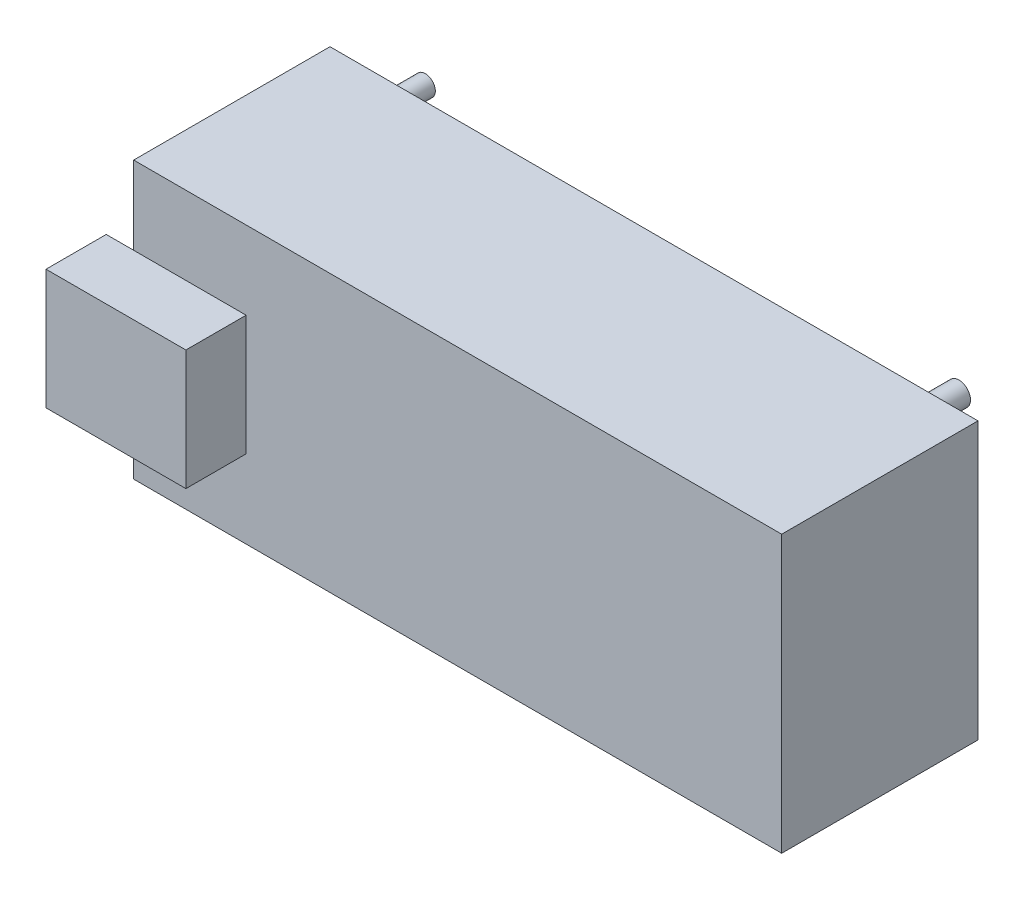
ISO-10303-21;
HEADER;
FILE_DESCRIPTION(('STEP AP214'),'2;1');
FILE_NAME('part.step','',(''),(''),'','','');
FILE_SCHEMA(('AUTOMOTIVE_DESIGN { 1 0 10303 214 1 1 1 1 }'));
ENDSEC;
DATA;
#1=APPLICATION_CONTEXT('core data for automotive mechanical design processes');
#2=APPLICATION_PROTOCOL_DEFINITION('international standard','automotive_design',2000,#1);
#3=PRODUCT_CONTEXT('',#1,'mechanical');
#4=PRODUCT('Part','Part','',(#3));
#5=PRODUCT_RELATED_PRODUCT_CATEGORY('part','',(#4));
#6=PRODUCT_DEFINITION_FORMATION('','',#4);
#7=PRODUCT_DEFINITION_CONTEXT('part definition',#1,'design');
#8=PRODUCT_DEFINITION('design','',#6,#7);
#9=PRODUCT_DEFINITION_SHAPE('','',#8);
#10=(LENGTH_UNIT() NAMED_UNIT(*) SI_UNIT(.MILLI.,.METRE.));
#11=(NAMED_UNIT(*) PLANE_ANGLE_UNIT() SI_UNIT($,.RADIAN.));
#12=(NAMED_UNIT(*) SI_UNIT($,.STERADIAN.) SOLID_ANGLE_UNIT());
#13=UNCERTAINTY_MEASURE_WITH_UNIT(LENGTH_MEASURE(1.E-05),#10,'distance_accuracy_value','');
#14=(GEOMETRIC_REPRESENTATION_CONTEXT(3) GLOBAL_UNCERTAINTY_ASSIGNED_CONTEXT((#13)) GLOBAL_UNIT_ASSIGNED_CONTEXT((#10,
#11,#12)) REPRESENTATION_CONTEXT('',''));
#15=CARTESIAN_POINT('',(0.,0.,0.));
#16=DIRECTION('',(0.,0.,1.));
#17=DIRECTION('',(1.,0.,0.));
#18=AXIS2_PLACEMENT_3D('',#15,#16,#17);
#19=CARTESIAN_POINT('',(-21.59,-9.2075,13.081));
#20=DIRECTION('',(0.,0.,-1.));
#21=DIRECTION('',(-1.,0.,0.));
#22=AXIS2_PLACEMENT_3D('',#19,#20,#21);
#23=PLANE('',#22);
#24=DIRECTION('',(1.,0.,0.));
#25=VECTOR('',#24,1.);
#26=CARTESIAN_POINT('',(-14.097,-4.0005,13.081));
#27=LINE('',#26,#25);
#28=CARTESIAN_POINT('',(-21.59,-4.0005,13.081));
#29=VERTEX_POINT('',#28);
#30=CARTESIAN_POINT('',(-14.097,-4.0005,13.081));
#31=VERTEX_POINT('',#30);
#32=EDGE_CURVE('E11',#29,#31,#27,.T.);
#33=ORIENTED_EDGE('',*,*,#32,.F.);
#34=DIRECTION('',(0.,-1.,0.));
#35=VECTOR('',#34,1.);
#36=CARTESIAN_POINT('',(-21.59,9.20749999999999,13.081));
#37=LINE('',#36,#35);
#38=CARTESIAN_POINT('',(-21.59,-9.2075,13.081));
#39=VERTEX_POINT('',#38);
#40=EDGE_CURVE('E155',#29,#39,#37,.T.);
#41=ORIENTED_EDGE('',*,*,#40,.T.);
#42=DIRECTION('',(1.,0.,0.));
#43=VECTOR('',#42,1.);
#44=CARTESIAN_POINT('',(21.59,-9.2075,13.081));
#45=LINE('',#44,#43);
#46=CARTESIAN_POINT('',(21.59,-9.2075,13.081));
#47=VERTEX_POINT('',#46);
#48=EDGE_CURVE('E153',#39,#47,#45,.T.);
#49=ORIENTED_EDGE('',*,*,#48,.T.);
#50=DIRECTION('',(0.,1.,0.));
#51=VECTOR('',#50,1.);
#52=CARTESIAN_POINT('',(21.59,9.2075,13.081));
#53=LINE('',#52,#51);
#54=CARTESIAN_POINT('',(21.59,9.2075,13.081));
#55=VERTEX_POINT('',#54);
#56=EDGE_CURVE('E157',#47,#55,#53,.T.);
#57=ORIENTED_EDGE('',*,*,#56,.T.);
#58=DIRECTION('',(-1.,0.,0.));
#59=VECTOR('',#58,1.);
#60=CARTESIAN_POINT('',(21.59,9.2075,13.081));
#61=LINE('',#60,#59);
#62=CARTESIAN_POINT('',(-21.59,9.20749999999999,13.081));
#63=VERTEX_POINT('',#62);
#64=EDGE_CURVE('E159',#55,#63,#61,.T.);
#65=ORIENTED_EDGE('',*,*,#64,.T.);
#66=CARTESIAN_POINT('',(-21.59,4.0005,13.081));
#67=VERTEX_POINT('',#66);
#68=EDGE_CURVE('E151',#63,#67,#37,.T.);
#69=ORIENTED_EDGE('',*,*,#68,.T.);
#70=DIRECTION('',(-1.,0.,0.));
#71=VECTOR('',#70,1.);
#72=CARTESIAN_POINT('',(-14.097,4.0005,13.081));
#73=LINE('',#72,#71);
#74=CARTESIAN_POINT('',(-14.097,4.0005,13.081));
#75=VERTEX_POINT('',#74);
#76=EDGE_CURVE('E51',#75,#67,#73,.T.);
#77=ORIENTED_EDGE('',*,*,#76,.F.);
#78=DIRECTION('',(0.,1.,0.));
#79=VECTOR('',#78,1.);
#80=CARTESIAN_POINT('',(-14.097,4.0005,13.081));
#81=LINE('',#80,#79);
#82=EDGE_CURVE('E47',#31,#75,#81,.T.);
#83=ORIENTED_EDGE('',*,*,#82,.F.);
#84=EDGE_LOOP('',(#33,#41,#49,#57,#65,#69,#77,#83));
#85=FACE_BOUND('',#84,.T.);
#86=ADVANCED_FACE('F30',(#85),#23,.F.);
#87=CARTESIAN_POINT('',(-21.59,-9.2075,0.));
#88=DIRECTION('',(0.,0.,-1.));
#89=DIRECTION('',(-1.,0.,0.));
#90=AXIS2_PLACEMENT_3D('',#87,#88,#89);
#91=PLANE('',#90);
#92=CARTESIAN_POINT('',(-17.78,-7.62,0.));
#93=DIRECTION('',(0.,0.,-1.));
#94=DIRECTION('',(-1.,0.,0.));
#95=AXIS2_PLACEMENT_3D('',#92,#93,#94);
#96=CIRCLE('',#95,0.762102327268927);
#97=CARTESIAN_POINT('',(-18.5421023272689,-7.62,0.));
#98=VERTEX_POINT('',#97);
#99=EDGE_CURVE('E131',#98,#98,#96,.T.);
#100=ORIENTED_EDGE('',*,*,#99,.F.);
#101=EDGE_LOOP('',(#100));
#102=FACE_BOUND('',#101,.T.);
#103=CARTESIAN_POINT('',(17.78,7.62,0.));
#104=DIRECTION('',(0.,0.,-1.));
#105=DIRECTION('',(-1.,0.,0.));
#106=AXIS2_PLACEMENT_3D('',#103,#104,#105);
#107=CIRCLE('',#106,0.769945782550909);
#108=CARTESIAN_POINT('',(17.0100542174491,7.62,0.));
#109=VERTEX_POINT('',#108);
#110=EDGE_CURVE('E142',#109,#109,#107,.T.);
#111=ORIENTED_EDGE('',*,*,#110,.F.);
#112=EDGE_LOOP('',(#111));
#113=FACE_BOUND('',#112,.T.);
#114=DIRECTION('',(0.,-1.,0.));
#115=VECTOR('',#114,1.);
#116=CARTESIAN_POINT('',(-21.59,9.20749999999999,0.));
#117=LINE('',#116,#115);
#118=CARTESIAN_POINT('',(-21.59,9.20749999999999,0.));
#119=VERTEX_POINT('',#118);
#120=CARTESIAN_POINT('',(-21.59,-9.2075,0.));
#121=VERTEX_POINT('',#120);
#122=EDGE_CURVE('E148',#119,#121,#117,.T.);
#123=ORIENTED_EDGE('',*,*,#122,.F.);
#124=DIRECTION('',(-1.,0.,0.));
#125=VECTOR('',#124,1.);
#126=CARTESIAN_POINT('',(21.59,9.2075,0.));
#127=LINE('',#126,#125);
#128=CARTESIAN_POINT('',(21.59,9.2075,0.));
#129=VERTEX_POINT('',#128);
#130=EDGE_CURVE('E168',#129,#119,#127,.T.);
#131=ORIENTED_EDGE('',*,*,#130,.F.);
#132=DIRECTION('',(0.,1.,0.));
#133=VECTOR('',#132,1.);
#134=CARTESIAN_POINT('',(21.59,9.2075,0.));
#135=LINE('',#134,#133);
#136=CARTESIAN_POINT('',(21.59,-9.2075,0.));
#137=VERTEX_POINT('',#136);
#138=EDGE_CURVE('E166',#137,#129,#135,.T.);
#139=ORIENTED_EDGE('',*,*,#138,.F.);
#140=DIRECTION('',(1.,0.,0.));
#141=VECTOR('',#140,1.);
#142=CARTESIAN_POINT('',(21.59,-9.2075,0.));
#143=LINE('',#142,#141);
#144=EDGE_CURVE('E164',#121,#137,#143,.T.);
#145=ORIENTED_EDGE('',*,*,#144,.F.);
#146=EDGE_LOOP('',(#123,#131,#139,#145));
#147=FACE_BOUND('',#146,.T.);
#148=CARTESIAN_POINT('',(17.78,-7.62,0.));
#149=DIRECTION('',(0.,0.,-1.));
#150=DIRECTION('',(-1.,0.,0.));
#151=AXIS2_PLACEMENT_3D('',#148,#149,#150);
#152=CIRCLE('',#151,0.721607374569189);
#153=CARTESIAN_POINT('',(17.0583926254308,-7.62,0.));
#154=VERTEX_POINT('',#153);
#155=EDGE_CURVE('E136',#154,#154,#152,.T.);
#156=ORIENTED_EDGE('',*,*,#155,.F.);
#157=EDGE_LOOP('',(#156));
#158=FACE_BOUND('',#157,.T.);
#159=CARTESIAN_POINT('',(-17.78,7.62,0.));
#160=DIRECTION('',(0.,0.,-1.));
#161=DIRECTION('',(-1.,0.,0.));
#162=AXIS2_PLACEMENT_3D('',#159,#160,#161);
#163=CIRCLE('',#162,0.671282843867284);
#164=CARTESIAN_POINT('',(-18.4512828438673,7.62,0.));
#165=VERTEX_POINT('',#164);
#166=EDGE_CURVE('E121',#165,#165,#163,.T.);
#167=ORIENTED_EDGE('',*,*,#166,.F.);
#168=EDGE_LOOP('',(#167));
#169=FACE_BOUND('',#168,.T.);
#170=ADVANCED_FACE('F192',(#102,#113,#147,#158,#169),#91,.T.);
#171=CARTESIAN_POINT('',(-21.59,9.20749999999999,13.081));
#172=DIRECTION('',(1.,0.,0.));
#173=DIRECTION('',(0.,0.,-1.));
#174=AXIS2_PLACEMENT_3D('',#171,#172,#173);
#175=PLANE('',#174);
#176=ORIENTED_EDGE('',*,*,#122,.T.);
#177=DIRECTION('',(0.,0.,-1.));
#178=VECTOR('',#177,1.);
#179=CARTESIAN_POINT('',(-21.59,-9.2075,13.081));
#180=LINE('',#179,#178);
#181=EDGE_CURVE('E34',#39,#121,#180,.T.);
#182=ORIENTED_EDGE('',*,*,#181,.F.);
#183=ORIENTED_EDGE('',*,*,#40,.F.);
#184=EDGE_CURVE('E154',#67,#29,#37,.T.);
#185=ORIENTED_EDGE('',*,*,#184,.F.);
#186=ORIENTED_EDGE('',*,*,#68,.F.);
#187=DIRECTION('',(0.,0.,-1.));
#188=VECTOR('',#187,1.);
#189=CARTESIAN_POINT('',(-21.59,9.20749999999999,13.081));
#190=LINE('',#189,#188);
#191=EDGE_CURVE('E161',#63,#119,#190,.T.);
#192=ORIENTED_EDGE('',*,*,#191,.T.);
#193=EDGE_LOOP('',(#176,#182,#183,#185,#186,#192));
#194=FACE_BOUND('',#193,.T.);
#195=ADVANCED_FACE('F32',(#194),#175,.F.);
#196=CARTESIAN_POINT('',(21.59,-9.2075,13.081));
#197=DIRECTION('',(0.,1.,0.));
#198=DIRECTION('',(-1.,0.,0.));
#199=AXIS2_PLACEMENT_3D('',#196,#197,#198);
#200=PLANE('',#199);
#201=ORIENTED_EDGE('',*,*,#144,.T.);
#202=DIRECTION('',(0.,0.,-1.));
#203=VECTOR('',#202,1.);
#204=CARTESIAN_POINT('',(21.59,-9.2075,13.081));
#205=LINE('',#204,#203);
#206=EDGE_CURVE('E174',#47,#137,#205,.T.);
#207=ORIENTED_EDGE('',*,*,#206,.F.);
#208=ORIENTED_EDGE('',*,*,#48,.F.);
#209=ORIENTED_EDGE('',*,*,#181,.T.);
#210=EDGE_LOOP('',(#201,#207,#208,#209));
#211=FACE_BOUND('',#210,.T.);
#212=ADVANCED_FACE('F184',(#211),#200,.F.);
#213=CARTESIAN_POINT('',(21.59,9.2075,13.081));
#214=DIRECTION('',(-1.,0.,0.));
#215=DIRECTION('',(0.,-1.,0.));
#216=AXIS2_PLACEMENT_3D('',#213,#214,#215);
#217=PLANE('',#216);
#218=ORIENTED_EDGE('',*,*,#138,.T.);
#219=DIRECTION('',(0.,0.,-1.));
#220=VECTOR('',#219,1.);
#221=CARTESIAN_POINT('',(21.59,9.2075,13.081));
#222=LINE('',#221,#220);
#223=EDGE_CURVE('E172',#55,#129,#222,.T.);
#224=ORIENTED_EDGE('',*,*,#223,.F.);
#225=ORIENTED_EDGE('',*,*,#56,.F.);
#226=ORIENTED_EDGE('',*,*,#206,.T.);
#227=EDGE_LOOP('',(#218,#224,#225,#226));
#228=FACE_BOUND('',#227,.T.);
#229=ADVANCED_FACE('F195',(#228),#217,.F.);
#230=CARTESIAN_POINT('',(21.59,9.2075,13.081));
#231=DIRECTION('',(0.,-1.,0.));
#232=DIRECTION('',(1.,0.,0.));
#233=AXIS2_PLACEMENT_3D('',#230,#231,#232);
#234=PLANE('',#233);
#235=ORIENTED_EDGE('',*,*,#130,.T.);
#236=ORIENTED_EDGE('',*,*,#191,.F.);
#237=ORIENTED_EDGE('',*,*,#64,.F.);
#238=ORIENTED_EDGE('',*,*,#223,.T.);
#239=EDGE_LOOP('',(#235,#236,#237,#238));
#240=FACE_BOUND('',#239,.T.);
#241=ADVANCED_FACE('F198',(#240),#234,.F.);
#242=CARTESIAN_POINT('',(17.78,7.62,-2.54));
#243=DIRECTION('',(0.,0.,1.));
#244=DIRECTION('',(1.,0.,0.));
#245=AXIS2_PLACEMENT_3D('',#242,#243,#244);
#246=CYLINDRICAL_SURFACE('',#245,0.769945782550909);
#247=CARTESIAN_POINT('',(17.78,7.62,-2.54));
#248=DIRECTION('',(0.,0.,-1.));
#249=DIRECTION('',(-1.,0.,0.));
#250=AXIS2_PLACEMENT_3D('',#247,#248,#249);
#251=CIRCLE('',#250,0.769945782550909);
#252=CARTESIAN_POINT('',(17.0100542174491,7.62,-2.54));
#253=VERTEX_POINT('',#252);
#254=EDGE_CURVE('E145',#253,#253,#251,.T.);
#255=ORIENTED_EDGE('',*,*,#254,.F.);
#256=EDGE_LOOP('',(#255));
#257=FACE_BOUND('',#256,.T.);
#258=ORIENTED_EDGE('',*,*,#110,.T.);
#259=EDGE_LOOP('',(#258));
#260=FACE_BOUND('',#259,.T.);
#261=ADVANCED_FACE('F238',(#257,#260),#246,.T.);
#262=CARTESIAN_POINT('',(17.78,7.62,-2.54));
#263=DIRECTION('',(0.,0.,-1.));
#264=DIRECTION('',(-1.,0.,0.));
#265=AXIS2_PLACEMENT_3D('',#262,#263,#264);
#266=PLANE('',#265);
#267=ORIENTED_EDGE('',*,*,#254,.T.);
#268=EDGE_LOOP('',(#267));
#269=FACE_BOUND('',#268,.T.);
#270=ADVANCED_FACE('F268',(#269),#266,.T.);
#271=CARTESIAN_POINT('',(17.78,-7.62,-2.54));
#272=DIRECTION('',(0.,0.,1.));
#273=DIRECTION('',(1.,0.,0.));
#274=AXIS2_PLACEMENT_3D('',#271,#272,#273);
#275=CYLINDRICAL_SURFACE('',#274,0.721607374569189);
#276=CARTESIAN_POINT('',(17.78,-7.62,-2.54));
#277=DIRECTION('',(0.,0.,-1.));
#278=DIRECTION('',(-1.,0.,0.));
#279=AXIS2_PLACEMENT_3D('',#276,#277,#278);
#280=CIRCLE('',#279,0.721607374569189);
#281=CARTESIAN_POINT('',(17.0583926254308,-7.62,-2.54));
#282=VERTEX_POINT('',#281);
#283=EDGE_CURVE('E139',#282,#282,#280,.T.);
#284=ORIENTED_EDGE('',*,*,#283,.F.);
#285=EDGE_LOOP('',(#284));
#286=FACE_BOUND('',#285,.T.);
#287=ORIENTED_EDGE('',*,*,#155,.T.);
#288=EDGE_LOOP('',(#287));
#289=FACE_BOUND('',#288,.T.);
#290=ADVANCED_FACE('F277',(#286,#289),#275,.T.);
#291=CARTESIAN_POINT('',(17.78,-7.62,-2.54));
#292=DIRECTION('',(0.,0.,-1.));
#293=DIRECTION('',(-1.,0.,0.));
#294=AXIS2_PLACEMENT_3D('',#291,#292,#293);
#295=PLANE('',#294);
#296=ORIENTED_EDGE('',*,*,#283,.T.);
#297=EDGE_LOOP('',(#296));
#298=FACE_BOUND('',#297,.T.);
#299=ADVANCED_FACE('F286',(#298),#295,.T.);
#300=CARTESIAN_POINT('',(-17.78,-7.62,-2.54));
#301=DIRECTION('',(0.,0.,1.));
#302=DIRECTION('',(1.,0.,0.));
#303=AXIS2_PLACEMENT_3D('',#300,#301,#302);
#304=CYLINDRICAL_SURFACE('',#303,0.762102327268927);
#305=CARTESIAN_POINT('',(-17.78,-7.62,-2.54));
#306=DIRECTION('',(0.,0.,-1.));
#307=DIRECTION('',(-1.,0.,0.));
#308=AXIS2_PLACEMENT_3D('',#305,#306,#307);
#309=CIRCLE('',#308,0.762102327268927);
#310=CARTESIAN_POINT('',(-18.5421023272689,-7.62,-2.54));
#311=VERTEX_POINT('',#310);
#312=EDGE_CURVE('E133',#311,#311,#309,.T.);
#313=ORIENTED_EDGE('',*,*,#312,.F.);
#314=EDGE_LOOP('',(#313));
#315=FACE_BOUND('',#314,.T.);
#316=ORIENTED_EDGE('',*,*,#99,.T.);
#317=EDGE_LOOP('',(#316));
#318=FACE_BOUND('',#317,.T.);
#319=ADVANCED_FACE('F296',(#315,#318),#304,.T.);
#320=CARTESIAN_POINT('',(-17.78,-7.62,-2.54));
#321=DIRECTION('',(0.,0.,-1.));
#322=DIRECTION('',(-1.,0.,0.));
#323=AXIS2_PLACEMENT_3D('',#320,#321,#322);
#324=PLANE('',#323);
#325=ORIENTED_EDGE('',*,*,#312,.T.);
#326=EDGE_LOOP('',(#325));
#327=FACE_BOUND('',#326,.T.);
#328=ADVANCED_FACE('F306',(#327),#324,.T.);
#329=CARTESIAN_POINT('',(-17.78,7.62,-2.54));
#330=DIRECTION('',(0.,0.,1.));
#331=DIRECTION('',(1.,0.,0.));
#332=AXIS2_PLACEMENT_3D('',#329,#330,#331);
#333=CYLINDRICAL_SURFACE('',#332,0.671282843867284);
#334=CARTESIAN_POINT('',(-17.78,7.62,-2.54));
#335=DIRECTION('',(0.,0.,-1.));
#336=DIRECTION('',(-1.,0.,0.));
#337=AXIS2_PLACEMENT_3D('',#334,#335,#336);
#338=CIRCLE('',#337,0.671282843867284);
#339=CARTESIAN_POINT('',(-18.4512828438673,7.62,-2.54));
#340=VERTEX_POINT('',#339);
#341=EDGE_CURVE('E124',#340,#340,#338,.T.);
#342=ORIENTED_EDGE('',*,*,#341,.F.);
#343=EDGE_LOOP('',(#342));
#344=FACE_BOUND('',#343,.T.);
#345=ORIENTED_EDGE('',*,*,#166,.T.);
#346=EDGE_LOOP('',(#345));
#347=FACE_BOUND('',#346,.T.);
#348=ADVANCED_FACE('F316',(#344,#347),#333,.T.);
#349=CARTESIAN_POINT('',(-17.78,7.62,-2.54));
#350=DIRECTION('',(0.,0.,-1.));
#351=DIRECTION('',(-1.,0.,0.));
#352=AXIS2_PLACEMENT_3D('',#349,#350,#351);
#353=PLANE('',#352);
#354=ORIENTED_EDGE('',*,*,#341,.T.);
#355=EDGE_LOOP('',(#354));
#356=FACE_BOUND('',#355,.T.);
#357=ADVANCED_FACE('F326',(#356),#353,.T.);
#358=CARTESIAN_POINT('',(-14.097,4.0005,17.0942));
#359=DIRECTION('',(-1.,0.,0.));
#360=DIRECTION('',(0.,0.,1.));
#361=AXIS2_PLACEMENT_3D('',#358,#359,#360);
#362=PLANE('',#361);
#363=ORIENTED_EDGE('',*,*,#82,.T.);
#364=DIRECTION('',(0.,0.,-1.));
#365=VECTOR('',#364,1.);
#366=CARTESIAN_POINT('',(-14.097,4.0005,17.0942));
#367=LINE('',#366,#365);
#368=CARTESIAN_POINT('',(-14.097,4.0005,17.0942));
#369=VERTEX_POINT('',#368);
#370=EDGE_CURVE('E104',#369,#75,#367,.T.);
#371=ORIENTED_EDGE('',*,*,#370,.F.);
#372=DIRECTION('',(0.,1.,0.));
#373=VECTOR('',#372,1.);
#374=CARTESIAN_POINT('',(-14.097,4.0005,17.0942));
#375=LINE('',#374,#373);
#376=CARTESIAN_POINT('',(-14.097,-4.0005,17.0942));
#377=VERTEX_POINT('',#376);
#378=EDGE_CURVE('E110',#377,#369,#375,.T.);
#379=ORIENTED_EDGE('',*,*,#378,.F.);
#380=DIRECTION('',(0.,0.,-1.));
#381=VECTOR('',#380,1.);
#382=CARTESIAN_POINT('',(-14.097,-4.0005,17.0942));
#383=LINE('',#382,#381);
#384=EDGE_CURVE('E216',#377,#31,#383,.T.);
#385=ORIENTED_EDGE('',*,*,#384,.T.);
#386=EDGE_LOOP('',(#363,#371,#379,#385));
#387=FACE_BOUND('',#386,.T.);
#388=ADVANCED_FACE('F120',(#387),#362,.F.);
#389=CARTESIAN_POINT('',(-14.097,4.0005,17.0942));
#390=DIRECTION('',(0.,-1.,0.));
#391=DIRECTION('',(0.,0.,-1.));
#392=AXIS2_PLACEMENT_3D('',#389,#390,#391);
#393=PLANE('',#392);
#394=ORIENTED_EDGE('',*,*,#76,.T.);
#395=CARTESIAN_POINT('',(-23.4188,4.0005,13.081));
#396=VERTEX_POINT('',#395);
#397=EDGE_CURVE('E207',#67,#396,#73,.T.);
#398=ORIENTED_EDGE('',*,*,#397,.T.);
#399=DIRECTION('',(0.,0.,-1.));
#400=VECTOR('',#399,1.);
#401=CARTESIAN_POINT('',(-23.4188,4.0005,17.0942));
#402=LINE('',#401,#400);
#403=CARTESIAN_POINT('',(-23.4188,4.0005,17.0942));
#404=VERTEX_POINT('',#403);
#405=EDGE_CURVE('E106',#404,#396,#402,.T.);
#406=ORIENTED_EDGE('',*,*,#405,.F.);
#407=DIRECTION('',(-1.,0.,0.));
#408=VECTOR('',#407,1.);
#409=CARTESIAN_POINT('',(-14.097,4.0005,17.0942));
#410=LINE('',#409,#408);
#411=EDGE_CURVE('E100',#369,#404,#410,.T.);
#412=ORIENTED_EDGE('',*,*,#411,.F.);
#413=ORIENTED_EDGE('',*,*,#370,.T.);
#414=EDGE_LOOP('',(#394,#398,#406,#412,#413));
#415=FACE_BOUND('',#414,.T.);
#416=ADVANCED_FACE('F102',(#415),#393,.F.);
#417=CARTESIAN_POINT('',(-23.4188,4.0005,17.0942));
#418=DIRECTION('',(1.,0.,0.));
#419=DIRECTION('',(0.,0.,-1.));
#420=AXIS2_PLACEMENT_3D('',#417,#418,#419);
#421=PLANE('',#420);
#422=DIRECTION('',(0.,-1.,0.));
#423=VECTOR('',#422,1.);
#424=CARTESIAN_POINT('',(-23.4188,4.0005,13.081));
#425=LINE('',#424,#423);
#426=CARTESIAN_POINT('',(-23.4188,-4.0005,13.081));
#427=VERTEX_POINT('',#426);
#428=EDGE_CURVE('E212',#396,#427,#425,.T.);
#429=ORIENTED_EDGE('',*,*,#428,.T.);
#430=DIRECTION('',(0.,0.,-1.));
#431=VECTOR('',#430,1.);
#432=CARTESIAN_POINT('',(-23.4188,-4.0005,17.0942));
#433=LINE('',#432,#431);
#434=CARTESIAN_POINT('',(-23.4188,-4.0005,17.0942));
#435=VERTEX_POINT('',#434);
#436=EDGE_CURVE('E126',#435,#427,#433,.T.);
#437=ORIENTED_EDGE('',*,*,#436,.F.);
#438=DIRECTION('',(0.,-1.,0.));
#439=VECTOR('',#438,1.);
#440=CARTESIAN_POINT('',(-23.4188,4.0005,17.0942));
#441=LINE('',#440,#439);
#442=EDGE_CURVE('E109',#404,#435,#441,.T.);
#443=ORIENTED_EDGE('',*,*,#442,.F.);
#444=ORIENTED_EDGE('',*,*,#405,.T.);
#445=EDGE_LOOP('',(#429,#437,#443,#444));
#446=FACE_BOUND('',#445,.T.);
#447=ADVANCED_FACE('F221',(#446),#421,.F.);
#448=CARTESIAN_POINT('',(-14.097,-4.0005,17.0942));
#449=DIRECTION('',(0.,1.,0.));
#450=DIRECTION('',(0.,0.,1.));
#451=AXIS2_PLACEMENT_3D('',#448,#449,#450);
#452=PLANE('',#451);
#453=EDGE_CURVE('E40',#427,#29,#27,.T.);
#454=ORIENTED_EDGE('',*,*,#453,.T.);
#455=ORIENTED_EDGE('',*,*,#32,.T.);
#456=ORIENTED_EDGE('',*,*,#384,.F.);
#457=DIRECTION('',(1.,0.,0.));
#458=VECTOR('',#457,1.);
#459=CARTESIAN_POINT('',(-14.097,-4.0005,17.0942));
#460=LINE('',#459,#458);
#461=EDGE_CURVE('E115',#435,#377,#460,.T.);
#462=ORIENTED_EDGE('',*,*,#461,.F.);
#463=ORIENTED_EDGE('',*,*,#436,.T.);
#464=EDGE_LOOP('',(#454,#455,#456,#462,#463));
#465=FACE_BOUND('',#464,.T.);
#466=ADVANCED_FACE('F210',(#465),#452,.F.);
#467=CARTESIAN_POINT('',(-14.097,-4.0005,17.0942));
#468=DIRECTION('',(0.,0.,-1.));
#469=DIRECTION('',(-1.,0.,0.));
#470=AXIS2_PLACEMENT_3D('',#467,#468,#469);
#471=PLANE('',#470);
#472=ORIENTED_EDGE('',*,*,#378,.T.);
#473=ORIENTED_EDGE('',*,*,#411,.T.);
#474=ORIENTED_EDGE('',*,*,#442,.T.);
#475=ORIENTED_EDGE('',*,*,#461,.T.);
#476=EDGE_LOOP('',(#472,#473,#474,#475));
#477=FACE_BOUND('',#476,.T.);
#478=ADVANCED_FACE('F113',(#477),#471,.F.);
#479=CARTESIAN_POINT('',(-14.097,-4.0005,13.081));
#480=DIRECTION('',(0.,0.,-1.));
#481=DIRECTION('',(-1.,0.,0.));
#482=AXIS2_PLACEMENT_3D('',#479,#480,#481);
#483=PLANE('',#482);
#484=ORIENTED_EDGE('',*,*,#397,.F.);
#485=ORIENTED_EDGE('',*,*,#184,.T.);
#486=ORIENTED_EDGE('',*,*,#453,.F.);
#487=ORIENTED_EDGE('',*,*,#428,.F.);
#488=EDGE_LOOP('',(#484,#485,#486,#487));
#489=FACE_BOUND('',#488,.T.);
#490=ADVANCED_FACE('F205',(#489),#483,.T.);
#491=CLOSED_SHELL('',(#86,#170,#195,#212,#229,#241,#261,#270,#290,#299,#319,#328,#348,#357,#388,
#416,#447,#466,#478,#490));
#492=MANIFOLD_SOLID_BREP('B2',#491);
#493=ADVANCED_BREP_SHAPE_REPRESENTATION('',(#18,#492),#14);
#494=SHAPE_DEFINITION_REPRESENTATION(#9,#493);
ENDSEC;
END-ISO-10303-21;
